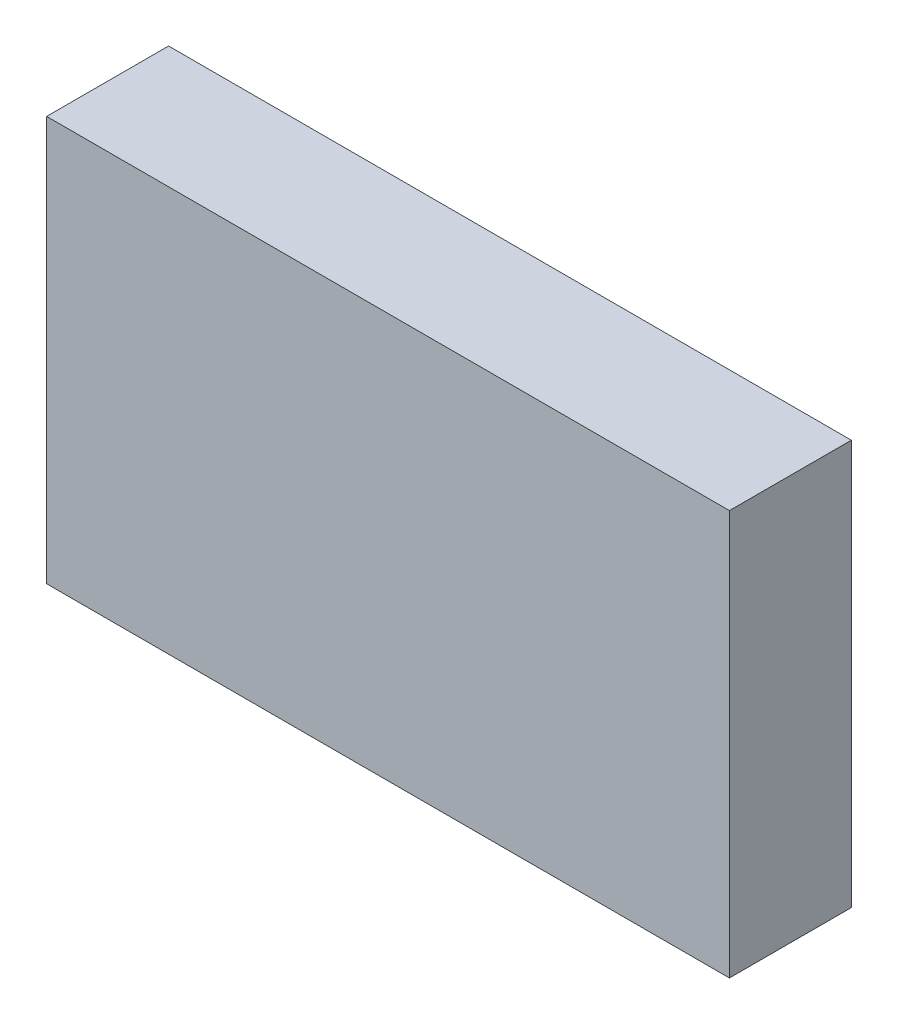
ISO-10303-21;
HEADER;
FILE_DESCRIPTION(('STEP AP214'),'2;1');
FILE_NAME('part.step','',(''),(''),'','','');
FILE_SCHEMA(('AUTOMOTIVE_DESIGN { 1 0 10303 214 1 1 1 1 }'));
ENDSEC;
DATA;
#1=APPLICATION_CONTEXT('core data for automotive mechanical design processes');
#2=APPLICATION_PROTOCOL_DEFINITION('international standard','automotive_design',2000,#1);
#3=PRODUCT_CONTEXT('',#1,'mechanical');
#4=PRODUCT('Part','Part','',(#3));
#5=PRODUCT_RELATED_PRODUCT_CATEGORY('part','',(#4));
#6=PRODUCT_DEFINITION_FORMATION('','',#4);
#7=PRODUCT_DEFINITION_CONTEXT('part definition',#1,'design');
#8=PRODUCT_DEFINITION('design','',#6,#7);
#9=PRODUCT_DEFINITION_SHAPE('','',#8);
#10=(LENGTH_UNIT() NAMED_UNIT(*) SI_UNIT(.MILLI.,.METRE.));
#11=(NAMED_UNIT(*) PLANE_ANGLE_UNIT() SI_UNIT($,.RADIAN.));
#12=(NAMED_UNIT(*) SI_UNIT($,.STERADIAN.) SOLID_ANGLE_UNIT());
#13=UNCERTAINTY_MEASURE_WITH_UNIT(LENGTH_MEASURE(1.E-05),#10,'distance_accuracy_value','');
#14=(GEOMETRIC_REPRESENTATION_CONTEXT(3) GLOBAL_UNCERTAINTY_ASSIGNED_CONTEXT((#13)) GLOBAL_UNIT_ASSIGNED_CONTEXT((#10,
#11,#12)) REPRESENTATION_CONTEXT('',''));
#15=CARTESIAN_POINT('',(0.,0.,0.));
#16=DIRECTION('',(0.,0.,1.));
#17=DIRECTION('',(1.,0.,0.));
#18=AXIS2_PLACEMENT_3D('',#15,#16,#17);
#19=CARTESIAN_POINT('',(-70.,-41.5,25.));
#20=DIRECTION('',(1.,0.,0.));
#21=DIRECTION('',(0.,0.,-1.));
#22=AXIS2_PLACEMENT_3D('',#19,#20,#21);
#23=PLANE('',#22);
#24=DIRECTION('',(0.,-1.,0.));
#25=VECTOR('',#24,1.);
#26=CARTESIAN_POINT('',(-70.,-41.5,0.));
#27=LINE('',#26,#25);
#28=CARTESIAN_POINT('',(-70.,41.5,0.));
#29=VERTEX_POINT('',#28);
#30=CARTESIAN_POINT('',(-70.,-41.5,0.));
#31=VERTEX_POINT('',#30);
#32=EDGE_CURVE('E107',#29,#31,#27,.T.);
#33=ORIENTED_EDGE('',*,*,#32,.T.);
#34=DIRECTION('',(0.,0.,-1.));
#35=VECTOR('',#34,1.);
#36=CARTESIAN_POINT('',(-70.,-41.5,25.));
#37=LINE('',#36,#35);
#38=CARTESIAN_POINT('',(-70.,-41.5,25.));
#39=VERTEX_POINT('',#38);
#40=EDGE_CURVE('E11',#39,#31,#37,.T.);
#41=ORIENTED_EDGE('',*,*,#40,.F.);
#42=DIRECTION('',(0.,-1.,0.));
#43=VECTOR('',#42,1.);
#44=CARTESIAN_POINT('',(-70.,-41.5,25.));
#45=LINE('',#44,#43);
#46=CARTESIAN_POINT('',(-70.,41.5,25.));
#47=VERTEX_POINT('',#46);
#48=EDGE_CURVE('E91',#47,#39,#45,.T.);
#49=ORIENTED_EDGE('',*,*,#48,.F.);
#50=DIRECTION('',(0.,0.,-1.));
#51=VECTOR('',#50,1.);
#52=CARTESIAN_POINT('',(-70.,41.5,25.));
#53=LINE('',#52,#51);
#54=EDGE_CURVE('E103',#47,#29,#53,.T.);
#55=ORIENTED_EDGE('',*,*,#54,.T.);
#56=EDGE_LOOP('',(#33,#41,#49,#55));
#57=FACE_BOUND('',#56,.T.);
#58=ADVANCED_FACE('F39',(#57),#23,.F.);
#59=CARTESIAN_POINT('',(70.,-41.5,25.));
#60=DIRECTION('',(0.,1.,0.));
#61=DIRECTION('',(-1.,0.,0.));
#62=AXIS2_PLACEMENT_3D('',#59,#60,#61);
#63=PLANE('',#62);
#64=DIRECTION('',(1.,0.,0.));
#65=VECTOR('',#64,1.);
#66=CARTESIAN_POINT('',(70.,-41.5,0.));
#67=LINE('',#66,#65);
#68=CARTESIAN_POINT('',(70.,-41.5,0.));
#69=VERTEX_POINT('',#68);
#70=EDGE_CURVE('E96',#31,#69,#67,.T.);
#71=ORIENTED_EDGE('',*,*,#70,.T.);
#72=DIRECTION('',(0.,0.,-1.));
#73=VECTOR('',#72,1.);
#74=CARTESIAN_POINT('',(70.,-41.5,25.));
#75=LINE('',#74,#73);
#76=CARTESIAN_POINT('',(70.,-41.5,25.));
#77=VERTEX_POINT('',#76);
#78=EDGE_CURVE('E48',#77,#69,#75,.T.);
#79=ORIENTED_EDGE('',*,*,#78,.F.);
#80=DIRECTION('',(1.,0.,0.));
#81=VECTOR('',#80,1.);
#82=CARTESIAN_POINT('',(70.,-41.5,25.));
#83=LINE('',#82,#81);
#84=EDGE_CURVE('E86',#39,#77,#83,.T.);
#85=ORIENTED_EDGE('',*,*,#84,.F.);
#86=ORIENTED_EDGE('',*,*,#40,.T.);
#87=EDGE_LOOP('',(#71,#79,#85,#86));
#88=FACE_BOUND('',#87,.T.);
#89=ADVANCED_FACE('F95',(#88),#63,.F.);
#90=CARTESIAN_POINT('',(70.,-41.5,25.));
#91=DIRECTION('',(-1.,0.,0.));
#92=DIRECTION('',(0.,0.,1.));
#93=AXIS2_PLACEMENT_3D('',#90,#91,#92);
#94=PLANE('',#93);
#95=DIRECTION('',(0.,1.,0.));
#96=VECTOR('',#95,1.);
#97=CARTESIAN_POINT('',(70.,-41.5,0.));
#98=LINE('',#97,#96);
#99=CARTESIAN_POINT('',(70.,41.5,0.));
#100=VERTEX_POINT('',#99);
#101=EDGE_CURVE('E73',#69,#100,#98,.T.);
#102=ORIENTED_EDGE('',*,*,#101,.T.);
#103=DIRECTION('',(0.,0.,-1.));
#104=VECTOR('',#103,1.);
#105=CARTESIAN_POINT('',(70.,41.5,25.));
#106=LINE('',#105,#104);
#107=CARTESIAN_POINT('',(70.,41.5,25.));
#108=VERTEX_POINT('',#107);
#109=EDGE_CURVE('E98',#108,#100,#106,.T.);
#110=ORIENTED_EDGE('',*,*,#109,.F.);
#111=DIRECTION('',(0.,1.,0.));
#112=VECTOR('',#111,1.);
#113=CARTESIAN_POINT('',(70.,-41.5,25.));
#114=LINE('',#113,#112);
#115=EDGE_CURVE('E89',#77,#108,#114,.T.);
#116=ORIENTED_EDGE('',*,*,#115,.F.);
#117=ORIENTED_EDGE('',*,*,#78,.T.);
#118=EDGE_LOOP('',(#102,#110,#116,#117));
#119=FACE_BOUND('',#118,.T.);
#120=ADVANCED_FACE('F99',(#119),#94,.F.);
#121=CARTESIAN_POINT('',(70.,41.5,25.));
#122=DIRECTION('',(0.,-1.,0.));
#123=DIRECTION('',(1.,0.,0.));
#124=AXIS2_PLACEMENT_3D('',#121,#122,#123);
#125=PLANE('',#124);
#126=DIRECTION('',(-1.,0.,0.));
#127=VECTOR('',#126,1.);
#128=CARTESIAN_POINT('',(70.,41.5,0.));
#129=LINE('',#128,#127);
#130=EDGE_CURVE('E79',#100,#29,#129,.T.);
#131=ORIENTED_EDGE('',*,*,#130,.T.);
#132=ORIENTED_EDGE('',*,*,#54,.F.);
#133=DIRECTION('',(-1.,0.,0.));
#134=VECTOR('',#133,1.);
#135=CARTESIAN_POINT('',(70.,41.5,25.));
#136=LINE('',#135,#134);
#137=EDGE_CURVE('E56',#108,#47,#136,.T.);
#138=ORIENTED_EDGE('',*,*,#137,.F.);
#139=ORIENTED_EDGE('',*,*,#109,.T.);
#140=EDGE_LOOP('',(#131,#132,#138,#139));
#141=FACE_BOUND('',#140,.T.);
#142=ADVANCED_FACE('F120',(#141),#125,.F.);
#143=CARTESIAN_POINT('',(0.,0.,25.));
#144=DIRECTION('',(0.,0.,1.));
#145=DIRECTION('',(1.,0.,0.));
#146=AXIS2_PLACEMENT_3D('',#143,#144,#145);
#147=PLANE('',#146);
#148=ORIENTED_EDGE('',*,*,#48,.T.);
#149=ORIENTED_EDGE('',*,*,#84,.T.);
#150=ORIENTED_EDGE('',*,*,#115,.T.);
#151=ORIENTED_EDGE('',*,*,#137,.T.);
#152=EDGE_LOOP('',(#148,#149,#150,#151));
#153=FACE_BOUND('',#152,.T.);
#154=ADVANCED_FACE('F87',(#153),#147,.T.);
#155=CARTESIAN_POINT('',(0.,0.,0.));
#156=DIRECTION('',(0.,0.,1.));
#157=DIRECTION('',(1.,0.,0.));
#158=AXIS2_PLACEMENT_3D('',#155,#156,#157);
#159=PLANE('',#158);
#160=ORIENTED_EDGE('',*,*,#32,.F.);
#161=ORIENTED_EDGE('',*,*,#130,.F.);
#162=ORIENTED_EDGE('',*,*,#101,.F.);
#163=ORIENTED_EDGE('',*,*,#70,.F.);
#164=EDGE_LOOP('',(#160,#161,#162,#163));
#165=FACE_BOUND('',#164,.T.);
#166=ADVANCED_FACE('F123',(#165),#159,.F.);
#167=CLOSED_SHELL('',(#58,#89,#120,#142,#154,#166));
#168=MANIFOLD_SOLID_BREP('B2',#167);
#169=ADVANCED_BREP_SHAPE_REPRESENTATION('',(#18,#168),#14);
#170=SHAPE_DEFINITION_REPRESENTATION(#9,#169);
ENDSEC;
END-ISO-10303-21;
